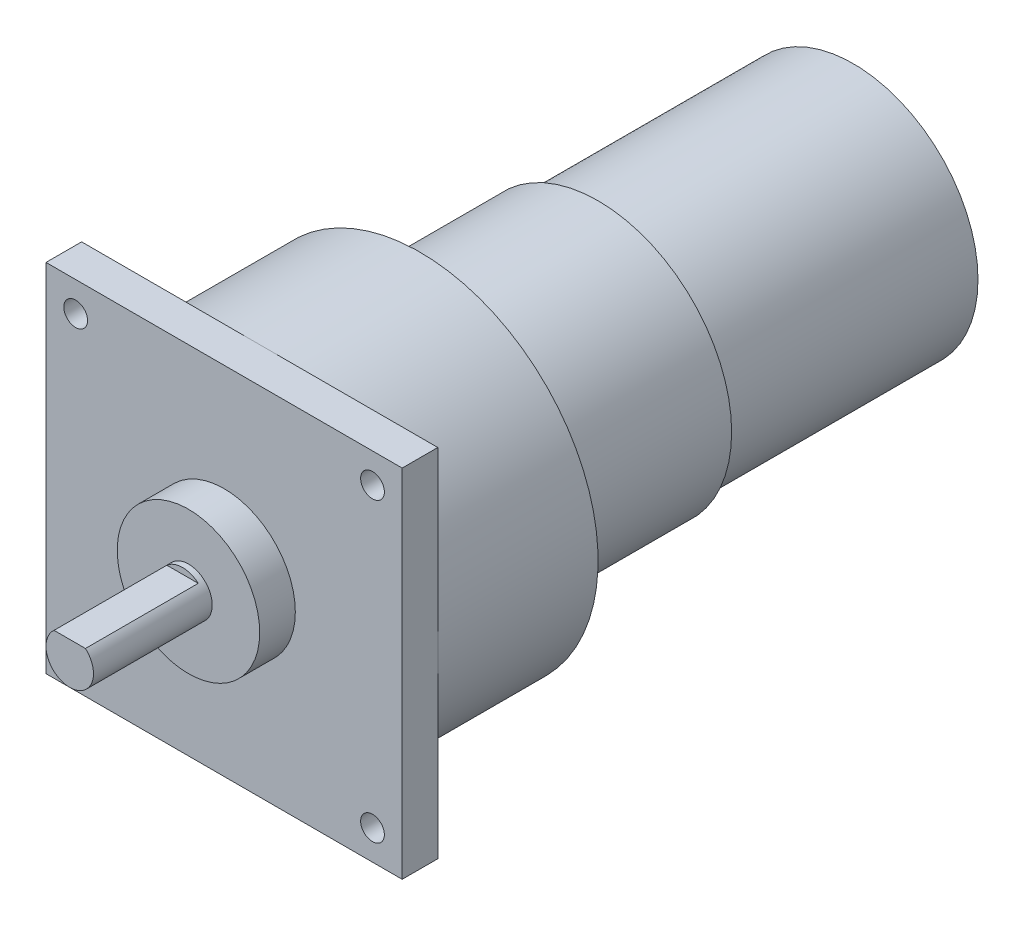
ISO-10303-21;
HEADER;
FILE_DESCRIPTION(('STEP AP214'),'2;1');
FILE_NAME('part.step','',(''),(''),'','','');
FILE_SCHEMA(('AUTOMOTIVE_DESIGN { 1 0 10303 214 1 1 1 1 }'));
ENDSEC;
DATA;
#1=APPLICATION_CONTEXT('core data for automotive mechanical design processes');
#2=APPLICATION_PROTOCOL_DEFINITION('international standard','automotive_design',2000,#1);
#3=PRODUCT_CONTEXT('',#1,'mechanical');
#4=PRODUCT('Part','Part','',(#3));
#5=PRODUCT_RELATED_PRODUCT_CATEGORY('part','',(#4));
#6=PRODUCT_DEFINITION_FORMATION('','',#4);
#7=PRODUCT_DEFINITION_CONTEXT('part definition',#1,'design');
#8=PRODUCT_DEFINITION('design','',#6,#7);
#9=PRODUCT_DEFINITION_SHAPE('','',#8);
#10=(LENGTH_UNIT() NAMED_UNIT(*) SI_UNIT(.MILLI.,.METRE.));
#11=(NAMED_UNIT(*) PLANE_ANGLE_UNIT() SI_UNIT($,.RADIAN.));
#12=(NAMED_UNIT(*) SI_UNIT($,.STERADIAN.) SOLID_ANGLE_UNIT());
#13=UNCERTAINTY_MEASURE_WITH_UNIT(LENGTH_MEASURE(1.E-05),#10,'distance_accuracy_value','');
#14=(GEOMETRIC_REPRESENTATION_CONTEXT(3) GLOBAL_UNCERTAINTY_ASSIGNED_CONTEXT((#13)) GLOBAL_UNIT_ASSIGNED_CONTEXT((#10,
#11,#12)) REPRESENTATION_CONTEXT('',''));
#15=CARTESIAN_POINT('',(0.,0.,0.));
#16=DIRECTION('',(0.,0.,1.));
#17=DIRECTION('',(1.,0.,0.));
#18=AXIS2_PLACEMENT_3D('',#15,#16,#17);
#19=CARTESIAN_POINT('',(0.,0.,0.));
#20=DIRECTION('',(0.,0.,1.));
#21=DIRECTION('',(1.,0.,0.));
#22=AXIS2_PLACEMENT_3D('',#19,#20,#21);
#23=PLANE('',#22);
#24=CARTESIAN_POINT('',(0.,0.,0.));
#25=DIRECTION('',(0.,0.,-1.));
#26=DIRECTION('',(-1.,0.,0.));
#27=AXIS2_PLACEMENT_3D('',#24,#25,#26);
#28=CIRCLE('',#27,30.);
#29=CARTESIAN_POINT('',(-30.,0.,0.));
#30=VERTEX_POINT('',#29);
#31=CARTESIAN_POINT('',(0.,30.,0.));
#32=VERTEX_POINT('',#31);
#33=EDGE_CURVE('E127',#30,#32,#28,.T.);
#34=ORIENTED_EDGE('',*,*,#33,.F.);
#35=DIRECTION('',(0.,-1.,0.));
#36=VECTOR('',#35,1.);
#37=CARTESIAN_POINT('',(-30.,30.,0.));
#38=LINE('',#37,#36);
#39=CARTESIAN_POINT('',(-30.,30.,0.));
#40=VERTEX_POINT('',#39);
#41=EDGE_CURVE('E109',#40,#30,#38,.T.);
#42=ORIENTED_EDGE('',*,*,#41,.F.);
#43=DIRECTION('',(-1.,0.,0.));
#44=VECTOR('',#43,1.);
#45=CARTESIAN_POINT('',(-30.,30.,0.));
#46=LINE('',#45,#44);
#47=EDGE_CURVE('E129',#32,#40,#46,.T.);
#48=ORIENTED_EDGE('',*,*,#47,.F.);
#49=EDGE_LOOP('',(#34,#42,#48));
#50=FACE_BOUND('',#49,.T.);
#51=CARTESIAN_POINT('',(-25.,25.,0.));
#52=DIRECTION('',(0.,0.,1.));
#53=DIRECTION('',(1.,0.,0.));
#54=AXIS2_PLACEMENT_3D('',#51,#52,#53);
#55=CIRCLE('',#54,2.00000000000001);
#56=CARTESIAN_POINT('',(-23.,25.,0.));
#57=VERTEX_POINT('',#56);
#58=EDGE_CURVE('E181',#57,#57,#55,.T.);
#59=ORIENTED_EDGE('',*,*,#58,.T.);
#60=EDGE_LOOP('',(#59));
#61=FACE_BOUND('',#60,.T.);
#62=ADVANCED_FACE('F38',(#50,#61),#23,.F.);
#63=CARTESIAN_POINT('',(30.,0.,0.));
#64=VERTEX_POINT('',#63);
#65=EDGE_CURVE('E55',#32,#64,#28,.T.);
#66=ORIENTED_EDGE('',*,*,#65,.F.);
#67=CARTESIAN_POINT('',(30.,30.,0.));
#68=VERTEX_POINT('',#67);
#69=EDGE_CURVE('E125',#68,#32,#46,.T.);
#70=ORIENTED_EDGE('',*,*,#69,.F.);
#71=DIRECTION('',(0.,1.,0.));
#72=VECTOR('',#71,1.);
#73=CARTESIAN_POINT('',(30.,30.,0.));
#74=LINE('',#73,#72);
#75=EDGE_CURVE('E187',#64,#68,#74,.T.);
#76=ORIENTED_EDGE('',*,*,#75,.F.);
#77=EDGE_LOOP('',(#66,#70,#76));
#78=FACE_BOUND('',#77,.T.);
#79=CARTESIAN_POINT('',(25.,25.,0.));
#80=DIRECTION('',(0.,0.,1.));
#81=DIRECTION('',(1.,0.,0.));
#82=AXIS2_PLACEMENT_3D('',#79,#80,#81);
#83=CIRCLE('',#82,2.);
#84=CARTESIAN_POINT('',(27.,25.,0.));
#85=VERTEX_POINT('',#84);
#86=EDGE_CURVE('E175',#85,#85,#83,.T.);
#87=ORIENTED_EDGE('',*,*,#86,.T.);
#88=EDGE_LOOP('',(#87));
#89=FACE_BOUND('',#88,.T.);
#90=ADVANCED_FACE('F215',(#78,#89),#23,.F.);
#91=CARTESIAN_POINT('',(0.,-30.,0.));
#92=VERTEX_POINT('',#91);
#93=EDGE_CURVE('E137',#64,#92,#28,.T.);
#94=ORIENTED_EDGE('',*,*,#93,.F.);
#95=CARTESIAN_POINT('',(30.,-30.,0.));
#96=VERTEX_POINT('',#95);
#97=EDGE_CURVE('E200',#96,#64,#74,.T.);
#98=ORIENTED_EDGE('',*,*,#97,.F.);
#99=DIRECTION('',(1.,0.,0.));
#100=VECTOR('',#99,1.);
#101=CARTESIAN_POINT('',(-30.,-30.,0.));
#102=LINE('',#101,#100);
#103=EDGE_CURVE('E119',#92,#96,#102,.T.);
#104=ORIENTED_EDGE('',*,*,#103,.F.);
#105=EDGE_LOOP('',(#94,#98,#104));
#106=FACE_BOUND('',#105,.T.);
#107=CARTESIAN_POINT('',(25.,-25.,0.));
#108=DIRECTION('',(0.,0.,1.));
#109=DIRECTION('',(1.,0.,0.));
#110=AXIS2_PLACEMENT_3D('',#107,#108,#109);
#111=CIRCLE('',#110,2.);
#112=CARTESIAN_POINT('',(27.,-25.,0.));
#113=VERTEX_POINT('',#112);
#114=EDGE_CURVE('E163',#113,#113,#111,.T.);
#115=ORIENTED_EDGE('',*,*,#114,.T.);
#116=EDGE_LOOP('',(#115));
#117=FACE_BOUND('',#116,.T.);
#118=ADVANCED_FACE('F218',(#106,#117),#23,.F.);
#119=CARTESIAN_POINT('',(0.,0.,6.));
#120=DIRECTION('',(0.,0.,1.));
#121=DIRECTION('',(1.,0.,0.));
#122=AXIS2_PLACEMENT_3D('',#119,#120,#121);
#123=PLANE('',#122);
#124=CARTESIAN_POINT('',(0.,0.,6.));
#125=DIRECTION('',(0.,0.,1.));
#126=DIRECTION('',(1.,0.,0.));
#127=AXIS2_PLACEMENT_3D('',#124,#125,#126);
#128=CIRCLE('',#127,12.);
#129=CARTESIAN_POINT('',(12.,0.,6.));
#130=VERTEX_POINT('',#129);
#131=EDGE_CURVE('E158',#130,#130,#128,.T.);
#132=ORIENTED_EDGE('',*,*,#131,.F.);
#133=EDGE_LOOP('',(#132));
#134=FACE_BOUND('',#133,.T.);
#135=CARTESIAN_POINT('',(-25.,-25.,6.));
#136=DIRECTION('',(0.,0.,1.));
#137=DIRECTION('',(1.,0.,0.));
#138=AXIS2_PLACEMENT_3D('',#135,#136,#137);
#139=CIRCLE('',#138,2.00000000000001);
#140=CARTESIAN_POINT('',(-23.,-25.,6.));
#141=VERTEX_POINT('',#140);
#142=EDGE_CURVE('E172',#141,#141,#139,.T.);
#143=ORIENTED_EDGE('',*,*,#142,.F.);
#144=EDGE_LOOP('',(#143));
#145=FACE_BOUND('',#144,.T.);
#146=CARTESIAN_POINT('',(-25.,25.,6.));
#147=DIRECTION('',(0.,0.,1.));
#148=DIRECTION('',(1.,0.,0.));
#149=AXIS2_PLACEMENT_3D('',#146,#147,#148);
#150=CIRCLE('',#149,2.00000000000001);
#151=CARTESIAN_POINT('',(-23.,25.,6.));
#152=VERTEX_POINT('',#151);
#153=EDGE_CURVE('E184',#152,#152,#150,.T.);
#154=ORIENTED_EDGE('',*,*,#153,.F.);
#155=EDGE_LOOP('',(#154));
#156=FACE_BOUND('',#155,.T.);
#157=DIRECTION('',(0.,1.,0.));
#158=VECTOR('',#157,1.);
#159=CARTESIAN_POINT('',(30.,30.,6.));
#160=LINE('',#159,#158);
#161=CARTESIAN_POINT('',(30.,-30.,6.));
#162=VERTEX_POINT('',#161);
#163=CARTESIAN_POINT('',(30.,30.,6.));
#164=VERTEX_POINT('',#163);
#165=EDGE_CURVE('E190',#162,#164,#160,.T.);
#166=ORIENTED_EDGE('',*,*,#165,.T.);
#167=DIRECTION('',(-1.,0.,0.));
#168=VECTOR('',#167,1.);
#169=CARTESIAN_POINT('',(-30.,30.,6.));
#170=LINE('',#169,#168);
#171=CARTESIAN_POINT('',(-30.,30.,6.));
#172=VERTEX_POINT('',#171);
#173=EDGE_CURVE('E193',#164,#172,#170,.T.);
#174=ORIENTED_EDGE('',*,*,#173,.T.);
#175=DIRECTION('',(0.,-1.,0.));
#176=VECTOR('',#175,1.);
#177=CARTESIAN_POINT('',(-30.,30.,6.));
#178=LINE('',#177,#176);
#179=CARTESIAN_POINT('',(-30.,-30.,6.));
#180=VERTEX_POINT('',#179);
#181=EDGE_CURVE('E195',#172,#180,#178,.T.);
#182=ORIENTED_EDGE('',*,*,#181,.T.);
#183=DIRECTION('',(1.,0.,0.));
#184=VECTOR('',#183,1.);
#185=CARTESIAN_POINT('',(-30.,-30.,6.));
#186=LINE('',#185,#184);
#187=EDGE_CURVE('E197',#180,#162,#186,.T.);
#188=ORIENTED_EDGE('',*,*,#187,.T.);
#189=EDGE_LOOP('',(#166,#174,#182,#188));
#190=FACE_BOUND('',#189,.T.);
#191=CARTESIAN_POINT('',(25.,25.,6.));
#192=DIRECTION('',(0.,0.,1.));
#193=DIRECTION('',(1.,0.,0.));
#194=AXIS2_PLACEMENT_3D('',#191,#192,#193);
#195=CIRCLE('',#194,2.);
#196=CARTESIAN_POINT('',(27.,25.,6.));
#197=VERTEX_POINT('',#196);
#198=EDGE_CURVE('E178',#197,#197,#195,.T.);
#199=ORIENTED_EDGE('',*,*,#198,.F.);
#200=EDGE_LOOP('',(#199));
#201=FACE_BOUND('',#200,.T.);
#202=CARTESIAN_POINT('',(25.,-25.,6.));
#203=DIRECTION('',(0.,0.,1.));
#204=DIRECTION('',(1.,0.,0.));
#205=AXIS2_PLACEMENT_3D('',#202,#203,#204);
#206=CIRCLE('',#205,2.);
#207=CARTESIAN_POINT('',(27.,-25.,6.));
#208=VERTEX_POINT('',#207);
#209=EDGE_CURVE('E166',#208,#208,#206,.T.);
#210=ORIENTED_EDGE('',*,*,#209,.F.);
#211=EDGE_LOOP('',(#210));
#212=FACE_BOUND('',#211,.T.);
#213=ADVANCED_FACE('F244',(#134,#145,#156,#190,#201,#212),#123,.T.);
#214=EDGE_CURVE('E63',#92,#30,#28,.T.);
#215=ORIENTED_EDGE('',*,*,#214,.F.);
#216=CARTESIAN_POINT('',(-30.,-30.,0.));
#217=VERTEX_POINT('',#216);
#218=EDGE_CURVE('E124',#217,#92,#102,.T.);
#219=ORIENTED_EDGE('',*,*,#218,.F.);
#220=EDGE_CURVE('E112',#30,#217,#38,.T.);
#221=ORIENTED_EDGE('',*,*,#220,.F.);
#222=EDGE_LOOP('',(#215,#219,#221));
#223=FACE_BOUND('',#222,.T.);
#224=CARTESIAN_POINT('',(-25.,-25.,0.));
#225=DIRECTION('',(0.,0.,1.));
#226=DIRECTION('',(1.,0.,0.));
#227=AXIS2_PLACEMENT_3D('',#224,#225,#226);
#228=CIRCLE('',#227,2.00000000000001);
#229=CARTESIAN_POINT('',(-23.,-25.,0.));
#230=VERTEX_POINT('',#229);
#231=EDGE_CURVE('E169',#230,#230,#228,.T.);
#232=ORIENTED_EDGE('',*,*,#231,.T.);
#233=EDGE_LOOP('',(#232));
#234=FACE_BOUND('',#233,.T.);
#235=ADVANCED_FACE('F121',(#223,#234),#23,.F.);
#236=CARTESIAN_POINT('',(30.,30.,6.));
#237=DIRECTION('',(-1.,0.,0.));
#238=DIRECTION('',(0.,-1.,0.));
#239=AXIS2_PLACEMENT_3D('',#236,#237,#238);
#240=PLANE('',#239);
#241=ORIENTED_EDGE('',*,*,#97,.T.);
#242=ORIENTED_EDGE('',*,*,#75,.T.);
#243=DIRECTION('',(0.,0.,-1.));
#244=VECTOR('',#243,1.);
#245=CARTESIAN_POINT('',(30.,30.,6.));
#246=LINE('',#245,#244);
#247=EDGE_CURVE('E42',#164,#68,#246,.T.);
#248=ORIENTED_EDGE('',*,*,#247,.F.);
#249=ORIENTED_EDGE('',*,*,#165,.F.);
#250=DIRECTION('',(0.,0.,-1.));
#251=VECTOR('',#250,1.);
#252=CARTESIAN_POINT('',(30.,-30.,6.));
#253=LINE('',#252,#251);
#254=EDGE_CURVE('E199',#162,#96,#253,.T.);
#255=ORIENTED_EDGE('',*,*,#254,.T.);
#256=EDGE_LOOP('',(#241,#242,#248,#249,#255));
#257=FACE_BOUND('',#256,.T.);
#258=ADVANCED_FACE('F40',(#257),#240,.F.);
#259=CARTESIAN_POINT('',(-30.,30.,6.));
#260=DIRECTION('',(0.,-1.,0.));
#261=DIRECTION('',(0.,0.,-1.));
#262=AXIS2_PLACEMENT_3D('',#259,#260,#261);
#263=PLANE('',#262);
#264=ORIENTED_EDGE('',*,*,#69,.T.);
#265=ORIENTED_EDGE('',*,*,#47,.T.);
#266=DIRECTION('',(0.,0.,-1.));
#267=VECTOR('',#266,1.);
#268=CARTESIAN_POINT('',(-30.,30.,6.));
#269=LINE('',#268,#267);
#270=EDGE_CURVE('E116',#172,#40,#269,.T.);
#271=ORIENTED_EDGE('',*,*,#270,.F.);
#272=ORIENTED_EDGE('',*,*,#173,.F.);
#273=ORIENTED_EDGE('',*,*,#247,.T.);
#274=EDGE_LOOP('',(#264,#265,#271,#272,#273));
#275=FACE_BOUND('',#274,.T.);
#276=ADVANCED_FACE('F211',(#275),#263,.F.);
#277=CARTESIAN_POINT('',(-30.,30.,6.));
#278=DIRECTION('',(1.,0.,0.));
#279=DIRECTION('',(0.,1.,0.));
#280=AXIS2_PLACEMENT_3D('',#277,#278,#279);
#281=PLANE('',#280);
#282=ORIENTED_EDGE('',*,*,#41,.T.);
#283=ORIENTED_EDGE('',*,*,#220,.T.);
#284=DIRECTION('',(0.,0.,-1.));
#285=VECTOR('',#284,1.);
#286=CARTESIAN_POINT('',(-30.,-30.,6.));
#287=LINE('',#286,#285);
#288=EDGE_CURVE('E207',#180,#217,#287,.T.);
#289=ORIENTED_EDGE('',*,*,#288,.F.);
#290=ORIENTED_EDGE('',*,*,#181,.F.);
#291=ORIENTED_EDGE('',*,*,#270,.T.);
#292=EDGE_LOOP('',(#282,#283,#289,#290,#291));
#293=FACE_BOUND('',#292,.T.);
#294=ADVANCED_FACE('F110',(#293),#281,.F.);
#295=CARTESIAN_POINT('',(-30.,-30.,6.));
#296=DIRECTION('',(0.,1.,0.));
#297=DIRECTION('',(0.,0.,1.));
#298=AXIS2_PLACEMENT_3D('',#295,#296,#297);
#299=PLANE('',#298);
#300=ORIENTED_EDGE('',*,*,#218,.T.);
#301=ORIENTED_EDGE('',*,*,#103,.T.);
#302=ORIENTED_EDGE('',*,*,#254,.F.);
#303=ORIENTED_EDGE('',*,*,#187,.F.);
#304=ORIENTED_EDGE('',*,*,#288,.T.);
#305=EDGE_LOOP('',(#300,#301,#302,#303,#304));
#306=FACE_BOUND('',#305,.T.);
#307=ADVANCED_FACE('F235',(#306),#299,.F.);
#308=CARTESIAN_POINT('',(-25.,25.,6.));
#309=DIRECTION('',(0.,0.,-1.));
#310=DIRECTION('',(-1.,0.,0.));
#311=AXIS2_PLACEMENT_3D('',#308,#309,#310);
#312=CYLINDRICAL_SURFACE('',#311,2.00000000000001);
#313=ORIENTED_EDGE('',*,*,#153,.T.);
#314=EDGE_LOOP('',(#313));
#315=FACE_BOUND('',#314,.T.);
#316=ORIENTED_EDGE('',*,*,#58,.F.);
#317=EDGE_LOOP('',(#316));
#318=FACE_BOUND('',#317,.T.);
#319=ADVANCED_FACE('F225',(#315,#318),#312,.F.);
#320=CARTESIAN_POINT('',(25.,25.,6.));
#321=DIRECTION('',(0.,0.,-1.));
#322=DIRECTION('',(-1.,0.,0.));
#323=AXIS2_PLACEMENT_3D('',#320,#321,#322);
#324=CYLINDRICAL_SURFACE('',#323,2.);
#325=ORIENTED_EDGE('',*,*,#198,.T.);
#326=EDGE_LOOP('',(#325));
#327=FACE_BOUND('',#326,.T.);
#328=ORIENTED_EDGE('',*,*,#86,.F.);
#329=EDGE_LOOP('',(#328));
#330=FACE_BOUND('',#329,.T.);
#331=ADVANCED_FACE('F222',(#327,#330),#324,.F.);
#332=CARTESIAN_POINT('',(-25.,-25.,6.));
#333=DIRECTION('',(0.,0.,-1.));
#334=DIRECTION('',(-1.,0.,0.));
#335=AXIS2_PLACEMENT_3D('',#332,#333,#334);
#336=CYLINDRICAL_SURFACE('',#335,2.00000000000001);
#337=ORIENTED_EDGE('',*,*,#142,.T.);
#338=EDGE_LOOP('',(#337));
#339=FACE_BOUND('',#338,.T.);
#340=ORIENTED_EDGE('',*,*,#231,.F.);
#341=EDGE_LOOP('',(#340));
#342=FACE_BOUND('',#341,.T.);
#343=ADVANCED_FACE('F224',(#339,#342),#336,.F.);
#344=CARTESIAN_POINT('',(25.,-25.,6.));
#345=DIRECTION('',(0.,0.,-1.));
#346=DIRECTION('',(-1.,0.,0.));
#347=AXIS2_PLACEMENT_3D('',#344,#345,#346);
#348=CYLINDRICAL_SURFACE('',#347,2.);
#349=ORIENTED_EDGE('',*,*,#209,.T.);
#350=EDGE_LOOP('',(#349));
#351=FACE_BOUND('',#350,.T.);
#352=ORIENTED_EDGE('',*,*,#114,.F.);
#353=EDGE_LOOP('',(#352));
#354=FACE_BOUND('',#353,.T.);
#355=ADVANCED_FACE('F232',(#351,#354),#348,.F.);
#356=CARTESIAN_POINT('',(0.,0.,12.));
#357=DIRECTION('',(0.,0.,-1.));
#358=DIRECTION('',(-1.,0.,0.));
#359=AXIS2_PLACEMENT_3D('',#356,#357,#358);
#360=CYLINDRICAL_SURFACE('',#359,12.);
#361=CARTESIAN_POINT('',(0.,0.,12.));
#362=DIRECTION('',(0.,0.,1.));
#363=DIRECTION('',(1.,0.,0.));
#364=AXIS2_PLACEMENT_3D('',#361,#362,#363);
#365=CIRCLE('',#364,12.);
#366=CARTESIAN_POINT('',(12.,0.,12.));
#367=VERTEX_POINT('',#366);
#368=EDGE_CURVE('E160',#367,#367,#365,.T.);
#369=ORIENTED_EDGE('',*,*,#368,.F.);
#370=EDGE_LOOP('',(#369));
#371=FACE_BOUND('',#370,.T.);
#372=ORIENTED_EDGE('',*,*,#131,.T.);
#373=EDGE_LOOP('',(#372));
#374=FACE_BOUND('',#373,.T.);
#375=ADVANCED_FACE('F258',(#371,#374),#360,.T.);
#376=CARTESIAN_POINT('',(0.,0.,12.));
#377=DIRECTION('',(0.,0.,1.));
#378=DIRECTION('',(1.,0.,0.));
#379=AXIS2_PLACEMENT_3D('',#376,#377,#378);
#380=PLANE('',#379);
#381=CARTESIAN_POINT('',(0.,0.,12.));
#382=DIRECTION('',(0.,0.,1.));
#383=DIRECTION('',(1.,0.,0.));
#384=AXIS2_PLACEMENT_3D('',#381,#382,#383);
#385=CIRCLE('',#384,4.);
#386=CARTESIAN_POINT('',(4.,0.,12.));
#387=VERTEX_POINT('',#386);
#388=EDGE_CURVE('E138',#387,#387,#385,.T.);
#389=ORIENTED_EDGE('',*,*,#388,.F.);
#390=EDGE_LOOP('',(#389));
#391=FACE_BOUND('',#390,.T.);
#392=ORIENTED_EDGE('',*,*,#368,.T.);
#393=EDGE_LOOP('',(#392));
#394=FACE_BOUND('',#393,.T.);
#395=ADVANCED_FACE('F264',(#391,#394),#380,.T.);
#396=CARTESIAN_POINT('',(0.,0.,32.));
#397=DIRECTION('',(0.,0.,-1.));
#398=DIRECTION('',(-1.,0.,0.));
#399=AXIS2_PLACEMENT_3D('',#396,#397,#398);
#400=CYLINDRICAL_SURFACE('',#399,4.);
#401=CARTESIAN_POINT('',(0.,0.,32.));
#402=DIRECTION('',(0.,0.,1.));
#403=DIRECTION('',(1.,0.,0.));
#404=AXIS2_PLACEMENT_3D('',#401,#402,#403);
#405=CIRCLE('',#404,4.);
#406=CARTESIAN_POINT('',(-2.64575131106459,3.,32.));
#407=VERTEX_POINT('',#406);
#408=CARTESIAN_POINT('',(2.64575131106459,3.,32.));
#409=VERTEX_POINT('',#408);
#410=EDGE_CURVE('E155',#407,#409,#405,.T.);
#411=ORIENTED_EDGE('',*,*,#410,.F.);
#412=DIRECTION('',(0.,0.,1.));
#413=VECTOR('',#412,1.);
#414=CARTESIAN_POINT('',(-2.64575131106459,3.,13.));
#415=LINE('',#414,#413);
#416=CARTESIAN_POINT('',(-2.64575131106459,3.,13.));
#417=VERTEX_POINT('',#416);
#418=EDGE_CURVE('E150',#417,#407,#415,.T.);
#419=ORIENTED_EDGE('',*,*,#418,.F.);
#420=CARTESIAN_POINT('',(0.,0.,13.));
#421=DIRECTION('',(0.,0.,1.));
#422=DIRECTION('',(-1.,0.,0.));
#423=AXIS2_PLACEMENT_3D('',#420,#421,#422);
#424=CIRCLE('',#423,4.);
#425=CARTESIAN_POINT('',(2.64575131106459,3.,13.));
#426=VERTEX_POINT('',#425);
#427=EDGE_CURVE('E144',#426,#417,#424,.T.);
#428=ORIENTED_EDGE('',*,*,#427,.F.);
#429=DIRECTION('',(0.,0.,1.));
#430=VECTOR('',#429,1.);
#431=CARTESIAN_POINT('',(2.64575131106459,3.,13.));
#432=LINE('',#431,#430);
#433=EDGE_CURVE('E152',#426,#409,#432,.T.);
#434=ORIENTED_EDGE('',*,*,#433,.T.);
#435=EDGE_LOOP('',(#411,#419,#428,#434));
#436=FACE_BOUND('',#435,.T.);
#437=ORIENTED_EDGE('',*,*,#388,.T.);
#438=EDGE_LOOP('',(#437));
#439=FACE_BOUND('',#438,.T.);
#440=ADVANCED_FACE('F270',(#436,#439),#400,.T.);
#441=CARTESIAN_POINT('',(0.,0.,32.));
#442=DIRECTION('',(0.,0.,1.));
#443=DIRECTION('',(1.,0.,0.));
#444=AXIS2_PLACEMENT_3D('',#441,#442,#443);
#445=PLANE('',#444);
#446=DIRECTION('',(1.,0.,0.));
#447=VECTOR('',#446,1.);
#448=CARTESIAN_POINT('',(-2.64575131106459,3.,32.));
#449=LINE('',#448,#447);
#450=EDGE_CURVE('E147',#407,#409,#449,.T.);
#451=ORIENTED_EDGE('',*,*,#450,.F.);
#452=ORIENTED_EDGE('',*,*,#410,.T.);
#453=EDGE_LOOP('',(#451,#452));
#454=FACE_BOUND('',#453,.T.);
#455=ADVANCED_FACE('F274',(#454),#445,.T.);
#456=CARTESIAN_POINT('',(-2.64575131106459,3.,13.));
#457=DIRECTION('',(0.,-1.,0.));
#458=DIRECTION('',(0.,0.,-1.));
#459=AXIS2_PLACEMENT_3D('',#456,#457,#458);
#460=PLANE('',#459);
#461=ORIENTED_EDGE('',*,*,#450,.T.);
#462=ORIENTED_EDGE('',*,*,#433,.F.);
#463=DIRECTION('',(1.,0.,0.));
#464=VECTOR('',#463,1.);
#465=CARTESIAN_POINT('',(-2.64575131106459,3.,13.));
#466=LINE('',#465,#464);
#467=EDGE_CURVE('E146',#417,#426,#466,.T.);
#468=ORIENTED_EDGE('',*,*,#467,.F.);
#469=ORIENTED_EDGE('',*,*,#418,.T.);
#470=EDGE_LOOP('',(#461,#462,#468,#469));
#471=FACE_BOUND('',#470,.T.);
#472=ADVANCED_FACE('F278',(#471),#460,.F.);
#473=CARTESIAN_POINT('',(0.,0.,13.));
#474=DIRECTION('',(0.,0.,-1.));
#475=DIRECTION('',(-1.,0.,0.));
#476=AXIS2_PLACEMENT_3D('',#473,#474,#475);
#477=PLANE('',#476);
#478=ORIENTED_EDGE('',*,*,#427,.T.);
#479=ORIENTED_EDGE('',*,*,#467,.T.);
#480=EDGE_LOOP('',(#478,#479));
#481=FACE_BOUND('',#480,.T.);
#482=ADVANCED_FACE('F282',(#481),#477,.F.);
#483=CARTESIAN_POINT('',(0.,0.,-27.));
#484=DIRECTION('',(0.,0.,1.));
#485=DIRECTION('',(1.,0.,0.));
#486=AXIS2_PLACEMENT_3D('',#483,#484,#485);
#487=CYLINDRICAL_SURFACE('',#486,30.);
#488=CARTESIAN_POINT('',(0.,0.,-27.));
#489=DIRECTION('',(0.,0.,-1.));
#490=DIRECTION('',(-1.,0.,0.));
#491=AXIS2_PLACEMENT_3D('',#488,#489,#490);
#492=CIRCLE('',#491,30.);
#493=CARTESIAN_POINT('',(-30.,0.,-27.));
#494=VERTEX_POINT('',#493);
#495=EDGE_CURVE('E132',#494,#494,#492,.T.);
#496=ORIENTED_EDGE('',*,*,#495,.F.);
#497=EDGE_LOOP('',(#496));
#498=FACE_BOUND('',#497,.T.);
#499=ORIENTED_EDGE('',*,*,#33,.T.);
#500=ORIENTED_EDGE('',*,*,#65,.T.);
#501=ORIENTED_EDGE('',*,*,#93,.T.);
#502=ORIENTED_EDGE('',*,*,#214,.T.);
#503=EDGE_LOOP('',(#499,#500,#501,#502));
#504=FACE_BOUND('',#503,.T.);
#505=ADVANCED_FACE('F136',(#498,#504),#487,.T.);
#506=CARTESIAN_POINT('',(0.,0.,-27.));
#507=DIRECTION('',(0.,0.,-1.));
#508=DIRECTION('',(-1.,0.,0.));
#509=AXIS2_PLACEMENT_3D('',#506,#507,#508);
#510=PLANE('',#509);
#511=CARTESIAN_POINT('',(0.,0.,-27.));
#512=DIRECTION('',(0.,0.,-1.));
#513=DIRECTION('',(-1.,0.,0.));
#514=AXIS2_PLACEMENT_3D('',#511,#512,#513);
#515=CIRCLE('',#514,22.5);
#516=CARTESIAN_POINT('',(-22.5,0.,-27.));
#517=VERTEX_POINT('',#516);
#518=EDGE_CURVE('E47',#517,#517,#515,.T.);
#519=ORIENTED_EDGE('',*,*,#518,.F.);
#520=EDGE_LOOP('',(#519));
#521=FACE_BOUND('',#520,.T.);
#522=ORIENTED_EDGE('',*,*,#495,.T.);
#523=EDGE_LOOP('',(#522));
#524=FACE_BOUND('',#523,.T.);
#525=ADVANCED_FACE('F289',(#521,#524),#510,.T.);
#526=CARTESIAN_POINT('',(0.,0.,-57.));
#527=DIRECTION('',(0.,0.,1.));
#528=DIRECTION('',(1.,0.,0.));
#529=AXIS2_PLACEMENT_3D('',#526,#527,#528);
#530=CYLINDRICAL_SURFACE('',#529,22.5);
#531=CARTESIAN_POINT('',(0.,0.,-57.));
#532=DIRECTION('',(0.,0.,-1.));
#533=DIRECTION('',(-1.,0.,0.));
#534=AXIS2_PLACEMENT_3D('',#531,#532,#533);
#535=CIRCLE('',#534,22.5);
#536=CARTESIAN_POINT('',(-22.5,0.,-57.));
#537=VERTEX_POINT('',#536);
#538=EDGE_CURVE('E133',#537,#537,#535,.T.);
#539=ORIENTED_EDGE('',*,*,#538,.F.);
#540=EDGE_LOOP('',(#539));
#541=FACE_BOUND('',#540,.T.);
#542=ORIENTED_EDGE('',*,*,#518,.T.);
#543=EDGE_LOOP('',(#542));
#544=FACE_BOUND('',#543,.T.);
#545=ADVANCED_FACE('F293',(#541,#544),#530,.T.);
#546=CARTESIAN_POINT('',(0.,0.,-57.));
#547=DIRECTION('',(0.,0.,-1.));
#548=DIRECTION('',(-1.,0.,0.));
#549=AXIS2_PLACEMENT_3D('',#546,#547,#548);
#550=PLANE('',#549);
#551=CARTESIAN_POINT('',(0.,0.,-57.));
#552=DIRECTION('',(0.,0.,-1.));
#553=DIRECTION('',(-1.,0.,0.));
#554=AXIS2_PLACEMENT_3D('',#551,#552,#553);
#555=CIRCLE('',#554,21.);
#556=CARTESIAN_POINT('',(-21.,0.,-57.));
#557=VERTEX_POINT('',#556);
#558=EDGE_CURVE('E11',#557,#557,#555,.T.);
#559=ORIENTED_EDGE('',*,*,#558,.F.);
#560=EDGE_LOOP('',(#559));
#561=FACE_BOUND('',#560,.T.);
#562=ORIENTED_EDGE('',*,*,#538,.T.);
#563=EDGE_LOOP('',(#562));
#564=FACE_BOUND('',#563,.T.);
#565=ADVANCED_FACE('F297',(#561,#564),#550,.T.);
#566=CARTESIAN_POINT('',(0.,0.,-100.));
#567=DIRECTION('',(0.,0.,1.));
#568=DIRECTION('',(1.,0.,0.));
#569=AXIS2_PLACEMENT_3D('',#566,#567,#568);
#570=CYLINDRICAL_SURFACE('',#569,21.);
#571=CARTESIAN_POINT('',(0.,0.,-100.));
#572=DIRECTION('',(0.,0.,-1.));
#573=DIRECTION('',(-1.,0.,0.));
#574=AXIS2_PLACEMENT_3D('',#571,#572,#573);
#575=CIRCLE('',#574,21.);
#576=CARTESIAN_POINT('',(-21.,0.,-100.));
#577=VERTEX_POINT('',#576);
#578=EDGE_CURVE('E313',#577,#577,#575,.T.);
#579=ORIENTED_EDGE('',*,*,#578,.F.);
#580=EDGE_LOOP('',(#579));
#581=FACE_BOUND('',#580,.T.);
#582=ORIENTED_EDGE('',*,*,#558,.T.);
#583=EDGE_LOOP('',(#582));
#584=FACE_BOUND('',#583,.T.);
#585=ADVANCED_FACE('F301',(#581,#584),#570,.T.);
#586=CARTESIAN_POINT('',(0.,0.,-100.));
#587=DIRECTION('',(0.,0.,-1.));
#588=DIRECTION('',(-1.,0.,0.));
#589=AXIS2_PLACEMENT_3D('',#586,#587,#588);
#590=PLANE('',#589);
#591=ORIENTED_EDGE('',*,*,#578,.T.);
#592=EDGE_LOOP('',(#591));
#593=FACE_BOUND('',#592,.T.);
#594=ADVANCED_FACE('F305',(#593),#590,.T.);
#595=CLOSED_SHELL('',(#62,#90,#118,#213,#235,#258,#276,#294,#307,#319,#331,#343,#355,#375,#395,
#440,#455,#472,#482,#505,#525,#545,#565,#585,#594));
#596=MANIFOLD_SOLID_BREP('B2',#595);
#597=ADVANCED_BREP_SHAPE_REPRESENTATION('',(#18,#596),#14);
#598=SHAPE_DEFINITION_REPRESENTATION(#9,#597);
ENDSEC;
END-ISO-10303-21;
